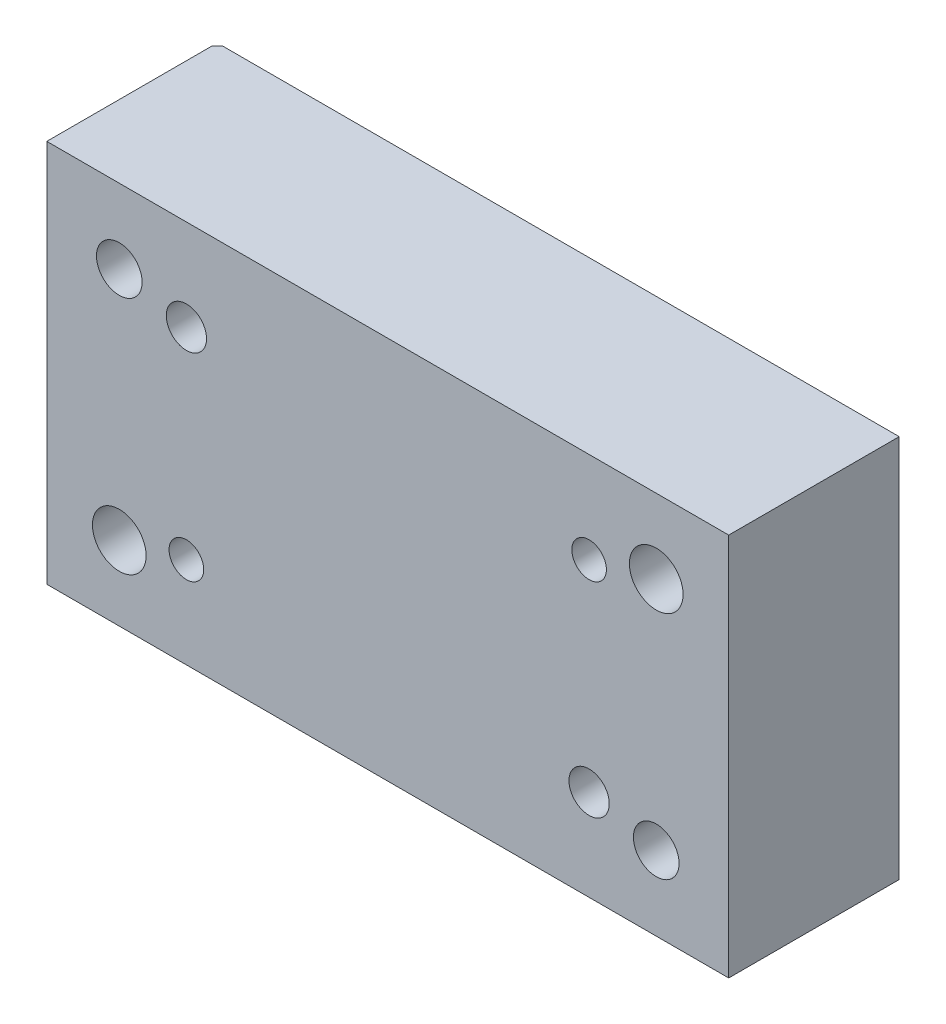
ISO-10303-21;
HEADER;
FILE_DESCRIPTION(('STEP AP214'),'2;1');
FILE_NAME('part.step','',(''),(''),'','','');
FILE_SCHEMA(('AUTOMOTIVE_DESIGN { 1 0 10303 214 1 1 1 1 }'));
ENDSEC;
DATA;
#1=APPLICATION_CONTEXT('core data for automotive mechanical design processes');
#2=APPLICATION_PROTOCOL_DEFINITION('international standard','automotive_design',2000,#1);
#3=PRODUCT_CONTEXT('',#1,'mechanical');
#4=PRODUCT('Part','Part','',(#3));
#5=PRODUCT_RELATED_PRODUCT_CATEGORY('part','',(#4));
#6=PRODUCT_DEFINITION_FORMATION('','',#4);
#7=PRODUCT_DEFINITION_CONTEXT('part definition',#1,'design');
#8=PRODUCT_DEFINITION('design','',#6,#7);
#9=PRODUCT_DEFINITION_SHAPE('','',#8);
#10=(LENGTH_UNIT() NAMED_UNIT(*) SI_UNIT(.MILLI.,.METRE.));
#11=(NAMED_UNIT(*) PLANE_ANGLE_UNIT() SI_UNIT($,.RADIAN.));
#12=(NAMED_UNIT(*) SI_UNIT($,.STERADIAN.) SOLID_ANGLE_UNIT());
#13=UNCERTAINTY_MEASURE_WITH_UNIT(LENGTH_MEASURE(1.E-05),#10,'distance_accuracy_value','');
#14=(GEOMETRIC_REPRESENTATION_CONTEXT(3) GLOBAL_UNCERTAINTY_ASSIGNED_CONTEXT((#13)) GLOBAL_UNIT_ASSIGNED_CONTEXT((#10,
#11,#12)) REPRESENTATION_CONTEXT('',''));
#15=CARTESIAN_POINT('',(0.,0.,0.));
#16=DIRECTION('',(0.,0.,1.));
#17=DIRECTION('',(1.,0.,0.));
#18=AXIS2_PLACEMENT_3D('',#15,#16,#17);
#19=CARTESIAN_POINT('',(-50.8,28.575,25.4));
#20=DIRECTION('',(1.,0.,0.));
#21=DIRECTION('',(0.,0.,-1.));
#22=AXIS2_PLACEMENT_3D('',#19,#20,#21);
#23=PLANE('',#22);
#24=DIRECTION('',(0.,0.707106781186547,0.707106781186548));
#25=VECTOR('',#24,1.);
#26=CARTESIAN_POINT('',(-50.8,40.878125,13.096875));
#27=LINE('',#26,#25);
#28=CARTESIAN_POINT('',(-50.8,27.78125,0.));
#29=VERTEX_POINT('',#28);
#30=CARTESIAN_POINT('',(-50.8,28.575,0.793749999999996));
#31=VERTEX_POINT('',#30);
#32=EDGE_CURVE('E91',#29,#31,#27,.T.);
#33=ORIENTED_EDGE('',*,*,#32,.F.);
#34=DIRECTION('',(0.,-1.,0.));
#35=VECTOR('',#34,1.);
#36=CARTESIAN_POINT('',(-50.8,28.575,0.));
#37=LINE('',#36,#35);
#38=CARTESIAN_POINT('',(-50.8,-28.575,0.));
#39=VERTEX_POINT('',#38);
#40=EDGE_CURVE('E80',#29,#39,#37,.T.);
#41=ORIENTED_EDGE('',*,*,#40,.T.);
#42=DIRECTION('',(0.,0.,-1.));
#43=VECTOR('',#42,1.);
#44=CARTESIAN_POINT('',(-50.8,-28.575,25.4));
#45=LINE('',#44,#43);
#46=CARTESIAN_POINT('',(-50.8,-28.575,25.4));
#47=VERTEX_POINT('',#46);
#48=EDGE_CURVE('E95',#47,#39,#45,.T.);
#49=ORIENTED_EDGE('',*,*,#48,.F.);
#50=DIRECTION('',(0.,-1.,0.));
#51=VECTOR('',#50,1.);
#52=CARTESIAN_POINT('',(-50.8,28.575,25.4));
#53=LINE('',#52,#51);
#54=CARTESIAN_POINT('',(-50.8,28.575,25.4));
#55=VERTEX_POINT('',#54);
#56=EDGE_CURVE('E111',#55,#47,#53,.T.);
#57=ORIENTED_EDGE('',*,*,#56,.F.);
#58=DIRECTION('',(0.,0.,-1.));
#59=VECTOR('',#58,1.);
#60=CARTESIAN_POINT('',(-50.8,28.575,25.4));
#61=LINE('',#60,#59);
#62=EDGE_CURVE('E93',#55,#31,#61,.T.);
#63=ORIENTED_EDGE('',*,*,#62,.T.);
#64=EDGE_LOOP('',(#33,#41,#49,#57,#63));
#65=FACE_BOUND('',#64,.T.);
#66=ADVANCED_FACE('F36',(#65),#23,.F.);
#67=CARTESIAN_POINT('',(-50.8,-28.575,25.4));
#68=DIRECTION('',(0.,1.,0.));
#69=DIRECTION('',(0.,0.,1.));
#70=AXIS2_PLACEMENT_3D('',#67,#68,#69);
#71=PLANE('',#70);
#72=DIRECTION('',(1.,0.,0.));
#73=VECTOR('',#72,1.);
#74=CARTESIAN_POINT('',(-50.8,-28.575,0.));
#75=LINE('',#74,#73);
#76=CARTESIAN_POINT('',(50.8,-28.575,0.));
#77=VERTEX_POINT('',#76);
#78=EDGE_CURVE('E84',#39,#77,#75,.T.);
#79=ORIENTED_EDGE('',*,*,#78,.T.);
#80=DIRECTION('',(0.,0.,-1.));
#81=VECTOR('',#80,1.);
#82=CARTESIAN_POINT('',(50.8,-28.575,25.4));
#83=LINE('',#82,#81);
#84=CARTESIAN_POINT('',(50.8,-28.575,25.4));
#85=VERTEX_POINT('',#84);
#86=EDGE_CURVE('E101',#85,#77,#83,.T.);
#87=ORIENTED_EDGE('',*,*,#86,.F.);
#88=DIRECTION('',(1.,0.,0.));
#89=VECTOR('',#88,1.);
#90=CARTESIAN_POINT('',(-50.8,-28.575,25.4));
#91=LINE('',#90,#89);
#92=EDGE_CURVE('E118',#47,#85,#91,.T.);
#93=ORIENTED_EDGE('',*,*,#92,.F.);
#94=ORIENTED_EDGE('',*,*,#48,.T.);
#95=EDGE_LOOP('',(#79,#87,#93,#94));
#96=FACE_BOUND('',#95,.T.);
#97=ADVANCED_FACE('F214',(#96),#71,.F.);
#98=CARTESIAN_POINT('',(50.8,28.575,25.4));
#99=DIRECTION('',(-1.,0.,0.));
#100=DIRECTION('',(0.,0.,1.));
#101=AXIS2_PLACEMENT_3D('',#98,#99,#100);
#102=PLANE('',#101);
#103=DIRECTION('',(0.,1.,0.));
#104=VECTOR('',#103,1.);
#105=CARTESIAN_POINT('',(50.8,28.575,0.));
#106=LINE('',#105,#104);
#107=CARTESIAN_POINT('',(50.8,28.575,0.));
#108=VERTEX_POINT('',#107);
#109=EDGE_CURVE('E112',#77,#108,#106,.T.);
#110=ORIENTED_EDGE('',*,*,#109,.T.);
#111=DIRECTION('',(0.,0.,-1.));
#112=VECTOR('',#111,1.);
#113=CARTESIAN_POINT('',(50.8,28.575,25.4));
#114=LINE('',#113,#112);
#115=CARTESIAN_POINT('',(50.8,28.575,25.4));
#116=VERTEX_POINT('',#115);
#117=EDGE_CURVE('E104',#116,#108,#114,.T.);
#118=ORIENTED_EDGE('',*,*,#117,.F.);
#119=DIRECTION('',(0.,1.,0.));
#120=VECTOR('',#119,1.);
#121=CARTESIAN_POINT('',(50.8,28.575,25.4));
#122=LINE('',#121,#120);
#123=EDGE_CURVE('E116',#85,#116,#122,.T.);
#124=ORIENTED_EDGE('',*,*,#123,.F.);
#125=ORIENTED_EDGE('',*,*,#86,.T.);
#126=EDGE_LOOP('',(#110,#118,#124,#125));
#127=FACE_BOUND('',#126,.T.);
#128=ADVANCED_FACE('F218',(#127),#102,.F.);
#129=CARTESIAN_POINT('',(-50.8,28.575,25.4));
#130=DIRECTION('',(0.,-1.,0.));
#131=DIRECTION('',(0.,0.,-1.));
#132=AXIS2_PLACEMENT_3D('',#129,#130,#131);
#133=PLANE('',#132);
#134=DIRECTION('',(0.707106781186548,0.,-0.707106781186547));
#135=VECTOR('',#134,1.);
#136=CARTESIAN_POINT('',(-63.103125,28.575,13.096875));
#137=LINE('',#136,#135);
#138=CARTESIAN_POINT('',(-50.00625,28.575,0.));
#139=VERTEX_POINT('',#138);
#140=EDGE_CURVE('E44',#31,#139,#137,.T.);
#141=ORIENTED_EDGE('',*,*,#140,.F.);
#142=ORIENTED_EDGE('',*,*,#62,.F.);
#143=DIRECTION('',(-1.,0.,0.));
#144=VECTOR('',#143,1.);
#145=CARTESIAN_POINT('',(-50.8,28.575,25.4));
#146=LINE('',#145,#144);
#147=EDGE_CURVE('E108',#116,#55,#146,.T.);
#148=ORIENTED_EDGE('',*,*,#147,.F.);
#149=ORIENTED_EDGE('',*,*,#117,.T.);
#150=DIRECTION('',(-1.,0.,0.));
#151=VECTOR('',#150,1.);
#152=CARTESIAN_POINT('',(-50.8,28.575,0.));
#153=LINE('',#152,#151);
#154=EDGE_CURVE('E109',#108,#139,#153,.T.);
#155=ORIENTED_EDGE('',*,*,#154,.T.);
#156=EDGE_LOOP('',(#141,#142,#148,#149,#155));
#157=FACE_BOUND('',#156,.T.);
#158=ADVANCED_FACE('F208',(#157),#133,.F.);
#159=CARTESIAN_POINT('',(0.,0.,25.4));
#160=DIRECTION('',(0.,0.,1.));
#161=DIRECTION('',(1.,0.,0.));
#162=AXIS2_PLACEMENT_3D('',#159,#160,#161);
#163=PLANE('',#162);
#164=CARTESIAN_POINT('',(29.9999999999999,-15.0000000000002,25.4));
#165=DIRECTION('',(0.,0.,-1.));
#166=DIRECTION('',(-1.,0.,0.));
#167=AXIS2_PLACEMENT_3D('',#164,#165,#166);
#168=CIRCLE('',#167,3.);
#169=CARTESIAN_POINT('',(26.9999999999999,-15.0000000000002,25.4));
#170=VERTEX_POINT('',#169);
#171=EDGE_CURVE('E172',#170,#170,#168,.T.);
#172=ORIENTED_EDGE('',*,*,#171,.T.);
#173=EDGE_LOOP('',(#172));
#174=FACE_BOUND('',#173,.T.);
#175=CARTESIAN_POINT('',(-30.,15.0000000000002,25.4));
#176=DIRECTION('',(0.,0.,-1.));
#177=DIRECTION('',(-1.,0.,0.));
#178=AXIS2_PLACEMENT_3D('',#175,#176,#177);
#179=CIRCLE('',#178,3.);
#180=CARTESIAN_POINT('',(-32.9999999999999,15.0000000000002,25.4));
#181=VERTEX_POINT('',#180);
#182=EDGE_CURVE('E166',#181,#181,#179,.T.);
#183=ORIENTED_EDGE('',*,*,#182,.T.);
#184=EDGE_LOOP('',(#183));
#185=FACE_BOUND('',#184,.T.);
#186=CARTESIAN_POINT('',(30.,14.9999999999998,25.4));
#187=DIRECTION('',(0.,0.,-1.));
#188=DIRECTION('',(-1.,0.,0.));
#189=AXIS2_PLACEMENT_3D('',#186,#187,#188);
#190=CIRCLE('',#189,2.57649999999999);
#191=CARTESIAN_POINT('',(27.4235000000001,14.9999999999998,25.4));
#192=VERTEX_POINT('',#191);
#193=EDGE_CURVE('E163',#192,#192,#190,.T.);
#194=ORIENTED_EDGE('',*,*,#193,.T.);
#195=EDGE_LOOP('',(#194));
#196=FACE_BOUND('',#195,.T.);
#197=CARTESIAN_POINT('',(-30.0000000000001,-14.9999999999998,25.4));
#198=DIRECTION('',(0.,0.,-1.));
#199=DIRECTION('',(-1.,0.,0.));
#200=AXIS2_PLACEMENT_3D('',#197,#198,#199);
#201=CIRCLE('',#200,2.5765);
#202=CARTESIAN_POINT('',(-32.5765000000001,-14.9999999999998,25.4));
#203=VERTEX_POINT('',#202);
#204=EDGE_CURVE('E160',#203,#203,#201,.T.);
#205=ORIENTED_EDGE('',*,*,#204,.T.);
#206=EDGE_LOOP('',(#205));
#207=FACE_BOUND('',#206,.T.);
#208=CARTESIAN_POINT('',(40.,-17.5,25.4));
#209=DIRECTION('',(0.,0.,1.));
#210=DIRECTION('',(1.,0.,0.));
#211=AXIS2_PLACEMENT_3D('',#208,#209,#210);
#212=CIRCLE('',#211,3.39999999999999);
#213=CARTESIAN_POINT('',(43.4,-17.5,25.4));
#214=VERTEX_POINT('',#213);
#215=EDGE_CURVE('E142',#214,#214,#212,.T.);
#216=ORIENTED_EDGE('',*,*,#215,.F.);
#217=EDGE_LOOP('',(#216));
#218=FACE_BOUND('',#217,.T.);
#219=CARTESIAN_POINT('',(-40.,17.5,25.4));
#220=DIRECTION('',(0.,0.,1.));
#221=DIRECTION('',(1.,0.,0.));
#222=AXIS2_PLACEMENT_3D('',#219,#220,#221);
#223=CIRCLE('',#222,3.39999999999999);
#224=CARTESIAN_POINT('',(-36.6000000000001,17.5,25.4));
#225=VERTEX_POINT('',#224);
#226=EDGE_CURVE('E136',#225,#225,#223,.T.);
#227=ORIENTED_EDGE('',*,*,#226,.F.);
#228=EDGE_LOOP('',(#227));
#229=FACE_BOUND('',#228,.T.);
#230=CARTESIAN_POINT('',(40.,17.5,25.4));
#231=DIRECTION('',(0.,0.,1.));
#232=DIRECTION('',(1.,0.,0.));
#233=AXIS2_PLACEMENT_3D('',#230,#231,#232);
#234=CIRCLE('',#233,3.99999999999999);
#235=CARTESIAN_POINT('',(44.,17.5,25.4));
#236=VERTEX_POINT('',#235);
#237=EDGE_CURVE('E130',#236,#236,#234,.T.);
#238=ORIENTED_EDGE('',*,*,#237,.F.);
#239=EDGE_LOOP('',(#238));
#240=FACE_BOUND('',#239,.T.);
#241=CARTESIAN_POINT('',(-40.,-17.5,25.4));
#242=DIRECTION('',(0.,0.,1.));
#243=DIRECTION('',(1.,0.,0.));
#244=AXIS2_PLACEMENT_3D('',#241,#242,#243);
#245=CIRCLE('',#244,3.99999999999999);
#246=CARTESIAN_POINT('',(-36.,-17.5,25.4));
#247=VERTEX_POINT('',#246);
#248=EDGE_CURVE('E124',#247,#247,#245,.T.);
#249=ORIENTED_EDGE('',*,*,#248,.F.);
#250=EDGE_LOOP('',(#249));
#251=FACE_BOUND('',#250,.T.);
#252=ORIENTED_EDGE('',*,*,#56,.T.);
#253=ORIENTED_EDGE('',*,*,#92,.T.);
#254=ORIENTED_EDGE('',*,*,#123,.T.);
#255=ORIENTED_EDGE('',*,*,#147,.T.);
#256=EDGE_LOOP('',(#252,#253,#254,#255));
#257=FACE_BOUND('',#256,.T.);
#258=ADVANCED_FACE('F183',(#174,#185,#196,#207,#218,#229,#240,#251,#257),#163,.T.);
#259=CARTESIAN_POINT('',(0.,0.,0.));
#260=DIRECTION('',(0.,0.,1.));
#261=DIRECTION('',(1.,0.,0.));
#262=AXIS2_PLACEMENT_3D('',#259,#260,#261);
#263=PLANE('',#262);
#264=CARTESIAN_POINT('',(29.9999999999999,-15.0000000000002,0.));
#265=DIRECTION('',(0.,0.,-1.));
#266=DIRECTION('',(-1.,0.,0.));
#267=AXIS2_PLACEMENT_3D('',#264,#265,#266);
#268=CIRCLE('',#267,3.);
#269=CARTESIAN_POINT('',(26.9999999999999,-15.0000000000002,0.));
#270=VERTEX_POINT('',#269);
#271=EDGE_CURVE('E175',#270,#270,#268,.T.);
#272=ORIENTED_EDGE('',*,*,#271,.F.);
#273=EDGE_LOOP('',(#272));
#274=FACE_BOUND('',#273,.T.);
#275=CARTESIAN_POINT('',(-30.,15.0000000000002,0.));
#276=DIRECTION('',(0.,0.,-1.));
#277=DIRECTION('',(-1.,0.,0.));
#278=AXIS2_PLACEMENT_3D('',#275,#276,#277);
#279=CIRCLE('',#278,3.);
#280=CARTESIAN_POINT('',(-32.9999999999999,15.0000000000002,0.));
#281=VERTEX_POINT('',#280);
#282=EDGE_CURVE('E169',#281,#281,#279,.T.);
#283=ORIENTED_EDGE('',*,*,#282,.F.);
#284=EDGE_LOOP('',(#283));
#285=FACE_BOUND('',#284,.T.);
#286=CARTESIAN_POINT('',(30.0000000000001,14.9999999999998,0.));
#287=DIRECTION('',(0.,0.,-1.));
#288=DIRECTION('',(-1.,0.,0.));
#289=AXIS2_PLACEMENT_3D('',#286,#287,#288);
#290=CIRCLE('',#289,4.99999999999999);
#291=CARTESIAN_POINT('',(25.0000000000001,14.9999999999998,0.));
#292=VERTEX_POINT('',#291);
#293=EDGE_CURVE('E154',#292,#292,#290,.T.);
#294=ORIENTED_EDGE('',*,*,#293,.F.);
#295=EDGE_LOOP('',(#294));
#296=FACE_BOUND('',#295,.T.);
#297=CARTESIAN_POINT('',(-30.0000000000001,-14.9999999999998,0.));
#298=DIRECTION('',(0.,0.,-1.));
#299=DIRECTION('',(-1.,0.,0.));
#300=AXIS2_PLACEMENT_3D('',#297,#298,#299);
#301=CIRCLE('',#300,4.99999999999999);
#302=CARTESIAN_POINT('',(-35.,-14.9999999999998,0.));
#303=VERTEX_POINT('',#302);
#304=EDGE_CURVE('E148',#303,#303,#301,.T.);
#305=ORIENTED_EDGE('',*,*,#304,.F.);
#306=EDGE_LOOP('',(#305));
#307=FACE_BOUND('',#306,.T.);
#308=CARTESIAN_POINT('',(40.,-17.5,0.));
#309=DIRECTION('',(0.,0.,1.));
#310=DIRECTION('',(1.,0.,0.));
#311=AXIS2_PLACEMENT_3D('',#308,#309,#310);
#312=CIRCLE('',#311,3.39999999999999);
#313=CARTESIAN_POINT('',(43.4,-17.5,0.));
#314=VERTEX_POINT('',#313);
#315=EDGE_CURVE('E139',#314,#314,#312,.T.);
#316=ORIENTED_EDGE('',*,*,#315,.T.);
#317=EDGE_LOOP('',(#316));
#318=FACE_BOUND('',#317,.T.);
#319=CARTESIAN_POINT('',(-40.,17.5,0.));
#320=DIRECTION('',(0.,0.,1.));
#321=DIRECTION('',(1.,0.,0.));
#322=AXIS2_PLACEMENT_3D('',#319,#320,#321);
#323=CIRCLE('',#322,3.39999999999999);
#324=CARTESIAN_POINT('',(-36.6000000000001,17.5,0.));
#325=VERTEX_POINT('',#324);
#326=EDGE_CURVE('E133',#325,#325,#323,.T.);
#327=ORIENTED_EDGE('',*,*,#326,.T.);
#328=EDGE_LOOP('',(#327));
#329=FACE_BOUND('',#328,.T.);
#330=CARTESIAN_POINT('',(40.,17.5,0.));
#331=DIRECTION('',(0.,0.,1.));
#332=DIRECTION('',(1.,0.,0.));
#333=AXIS2_PLACEMENT_3D('',#330,#331,#332);
#334=CIRCLE('',#333,3.99999999999998);
#335=CARTESIAN_POINT('',(44.,17.5,0.));
#336=VERTEX_POINT('',#335);
#337=EDGE_CURVE('E127',#336,#336,#334,.T.);
#338=ORIENTED_EDGE('',*,*,#337,.T.);
#339=EDGE_LOOP('',(#338));
#340=FACE_BOUND('',#339,.T.);
#341=CARTESIAN_POINT('',(-40.,-17.5,0.));
#342=DIRECTION('',(0.,0.,1.));
#343=DIRECTION('',(1.,0.,0.));
#344=AXIS2_PLACEMENT_3D('',#341,#342,#343);
#345=CIRCLE('',#344,3.99999999999998);
#346=CARTESIAN_POINT('',(-36.,-17.5,0.));
#347=VERTEX_POINT('',#346);
#348=EDGE_CURVE('E88',#347,#347,#345,.T.);
#349=ORIENTED_EDGE('',*,*,#348,.T.);
#350=EDGE_LOOP('',(#349));
#351=FACE_BOUND('',#350,.T.);
#352=DIRECTION('',(-0.707106781186549,-0.707106781186546,0.));
#353=VECTOR('',#352,1.);
#354=CARTESIAN_POINT('',(-39.2906249999999,39.2906250000001,0.));
#355=LINE('',#354,#353);
#356=EDGE_CURVE('E11',#139,#29,#355,.T.);
#357=ORIENTED_EDGE('',*,*,#356,.F.);
#358=ORIENTED_EDGE('',*,*,#154,.F.);
#359=ORIENTED_EDGE('',*,*,#109,.F.);
#360=ORIENTED_EDGE('',*,*,#78,.F.);
#361=ORIENTED_EDGE('',*,*,#40,.F.);
#362=EDGE_LOOP('',(#357,#358,#359,#360,#361));
#363=FACE_BOUND('',#362,.T.);
#364=ADVANCED_FACE('F82',(#274,#285,#296,#307,#318,#329,#340,#351,#363),#263,.F.);
#365=CARTESIAN_POINT('',(-26.1937499999999,26.19375,-26.19375));
#366=DIRECTION('',(-0.577350269189624,0.577350269189627,-0.577350269189626));
#367=DIRECTION('',(0.,0.707106781186547,0.707106781186548));
#368=AXIS2_PLACEMENT_3D('',#365,#366,#367);
#369=PLANE('',#368);
#370=ORIENTED_EDGE('',*,*,#356,.T.);
#371=ORIENTED_EDGE('',*,*,#32,.T.);
#372=ORIENTED_EDGE('',*,*,#140,.T.);
#373=EDGE_LOOP('',(#370,#371,#372));
#374=FACE_BOUND('',#373,.T.);
#375=ADVANCED_FACE('F97',(#374),#369,.T.);
#376=CARTESIAN_POINT('',(-40.,-17.5,25.4));
#377=DIRECTION('',(0.,0.,1.));
#378=DIRECTION('',(1.,0.,0.));
#379=AXIS2_PLACEMENT_3D('',#376,#377,#378);
#380=CYLINDRICAL_SURFACE('',#379,3.99999999999999);
#381=ORIENTED_EDGE('',*,*,#348,.F.);
#382=EDGE_LOOP('',(#381));
#383=FACE_BOUND('',#382,.T.);
#384=ORIENTED_EDGE('',*,*,#248,.T.);
#385=EDGE_LOOP('',(#384));
#386=FACE_BOUND('',#385,.T.);
#387=ADVANCED_FACE('F199',(#383,#386),#380,.F.);
#388=CARTESIAN_POINT('',(40.,17.5,25.4));
#389=DIRECTION('',(0.,0.,1.));
#390=DIRECTION('',(1.,0.,0.));
#391=AXIS2_PLACEMENT_3D('',#388,#389,#390);
#392=CYLINDRICAL_SURFACE('',#391,3.99999999999999);
#393=ORIENTED_EDGE('',*,*,#337,.F.);
#394=EDGE_LOOP('',(#393));
#395=FACE_BOUND('',#394,.T.);
#396=ORIENTED_EDGE('',*,*,#237,.T.);
#397=EDGE_LOOP('',(#396));
#398=FACE_BOUND('',#397,.T.);
#399=ADVANCED_FACE('F202',(#395,#398),#392,.F.);
#400=CARTESIAN_POINT('',(-40.,17.5,25.4));
#401=DIRECTION('',(0.,0.,1.));
#402=DIRECTION('',(1.,0.,0.));
#403=AXIS2_PLACEMENT_3D('',#400,#401,#402);
#404=CYLINDRICAL_SURFACE('',#403,3.39999999999999);
#405=ORIENTED_EDGE('',*,*,#326,.F.);
#406=EDGE_LOOP('',(#405));
#407=FACE_BOUND('',#406,.T.);
#408=ORIENTED_EDGE('',*,*,#226,.T.);
#409=EDGE_LOOP('',(#408));
#410=FACE_BOUND('',#409,.T.);
#411=ADVANCED_FACE('F268',(#407,#410),#404,.F.);
#412=CARTESIAN_POINT('',(40.,-17.5,25.4));
#413=DIRECTION('',(0.,0.,1.));
#414=DIRECTION('',(1.,0.,0.));
#415=AXIS2_PLACEMENT_3D('',#412,#413,#414);
#416=CYLINDRICAL_SURFACE('',#415,3.39999999999999);
#417=ORIENTED_EDGE('',*,*,#315,.F.);
#418=EDGE_LOOP('',(#417));
#419=FACE_BOUND('',#418,.T.);
#420=ORIENTED_EDGE('',*,*,#215,.T.);
#421=EDGE_LOOP('',(#420));
#422=FACE_BOUND('',#421,.T.);
#423=ADVANCED_FACE('F279',(#419,#422),#416,.F.);
#424=CARTESIAN_POINT('',(-30.0000000000001,-14.9999999999998,5.999988));
#425=DIRECTION('',(0.,0.,-1.));
#426=DIRECTION('',(-1.,0.,0.));
#427=AXIS2_PLACEMENT_3D('',#424,#425,#426);
#428=CONICAL_SURFACE('',#427,5.,1.02974425867665);
#429=CARTESIAN_POINT('',(-30.0000000000001,-14.9999999999998,7.4561737102133));
#430=DIRECTION('',(0.,0.,-1.));
#431=DIRECTION('',(-1.,0.,0.));
#432=AXIS2_PLACEMENT_3D('',#429,#430,#431);
#433=CIRCLE('',#432,2.57649999999999);
#434=CARTESIAN_POINT('',(-32.5765000000001,-14.9999999999998,7.4561737102133));
#435=VERTEX_POINT('',#434);
#436=EDGE_CURVE('E157',#435,#435,#433,.F.);
#437=ORIENTED_EDGE('',*,*,#436,.T.);
#438=EDGE_LOOP('',(#437));
#439=FACE_BOUND('',#438,.T.);
#440=CARTESIAN_POINT('',(-30.0000000000001,-14.9999999999998,5.999988));
#441=DIRECTION('',(0.,0.,-1.));
#442=DIRECTION('',(-1.,0.,0.));
#443=AXIS2_PLACEMENT_3D('',#440,#441,#442);
#444=CIRCLE('',#443,5.);
#445=CARTESIAN_POINT('',(-35.,-14.9999999999998,5.999988));
#446=VERTEX_POINT('',#445);
#447=EDGE_CURVE('E145',#446,#446,#444,.T.);
#448=ORIENTED_EDGE('',*,*,#447,.T.);
#449=EDGE_LOOP('',(#448));
#450=FACE_BOUND('',#449,.T.);
#451=ADVANCED_FACE('F291',(#439,#450),#428,.F.);
#452=CARTESIAN_POINT('',(-30.0000000000001,-14.9999999999998,0.));
#453=DIRECTION('',(0.,0.,-1.));
#454=DIRECTION('',(-1.,0.,0.));
#455=AXIS2_PLACEMENT_3D('',#452,#453,#454);
#456=CYLINDRICAL_SURFACE('',#455,4.99999999999999);
#457=ORIENTED_EDGE('',*,*,#447,.F.);
#458=EDGE_LOOP('',(#457));
#459=FACE_BOUND('',#458,.T.);
#460=ORIENTED_EDGE('',*,*,#304,.T.);
#461=EDGE_LOOP('',(#460));
#462=FACE_BOUND('',#461,.T.);
#463=ADVANCED_FACE('F299',(#459,#462),#456,.F.);
#464=CARTESIAN_POINT('',(30.0000000000001,14.9999999999998,5.999988));
#465=DIRECTION('',(0.,0.,-1.));
#466=DIRECTION('',(-1.,0.,0.));
#467=AXIS2_PLACEMENT_3D('',#464,#465,#466);
#468=CONICAL_SURFACE('',#467,5.,1.02974425867665);
#469=CARTESIAN_POINT('',(30.0000000000001,14.9999999999998,7.4561737102133));
#470=DIRECTION('',(0.,0.,-1.));
#471=DIRECTION('',(-1.,0.,0.));
#472=AXIS2_PLACEMENT_3D('',#469,#470,#471);
#473=CIRCLE('',#472,2.57649999999999);
#474=CARTESIAN_POINT('',(27.4235000000001,14.9999999999998,7.4561737102133));
#475=VERTEX_POINT('',#474);
#476=EDGE_CURVE('E39',#475,#475,#473,.F.);
#477=ORIENTED_EDGE('',*,*,#476,.T.);
#478=EDGE_LOOP('',(#477));
#479=FACE_BOUND('',#478,.T.);
#480=CARTESIAN_POINT('',(30.0000000000001,14.9999999999998,5.999988));
#481=DIRECTION('',(0.,0.,-1.));
#482=DIRECTION('',(-1.,0.,0.));
#483=AXIS2_PLACEMENT_3D('',#480,#481,#482);
#484=CIRCLE('',#483,5.);
#485=CARTESIAN_POINT('',(25.0000000000001,14.9999999999998,5.999988));
#486=VERTEX_POINT('',#485);
#487=EDGE_CURVE('E151',#486,#486,#484,.T.);
#488=ORIENTED_EDGE('',*,*,#487,.T.);
#489=EDGE_LOOP('',(#488));
#490=FACE_BOUND('',#489,.T.);
#491=ADVANCED_FACE('F304',(#479,#490),#468,.F.);
#492=CARTESIAN_POINT('',(30.0000000000001,14.9999999999998,0.));
#493=DIRECTION('',(0.,0.,-1.));
#494=DIRECTION('',(-1.,0.,0.));
#495=AXIS2_PLACEMENT_3D('',#492,#493,#494);
#496=CYLINDRICAL_SURFACE('',#495,4.99999999999999);
#497=ORIENTED_EDGE('',*,*,#487,.F.);
#498=EDGE_LOOP('',(#497));
#499=FACE_BOUND('',#498,.T.);
#500=ORIENTED_EDGE('',*,*,#293,.T.);
#501=EDGE_LOOP('',(#500));
#502=FACE_BOUND('',#501,.T.);
#503=ADVANCED_FACE('F313',(#499,#502),#496,.F.);
#504=CARTESIAN_POINT('',(-30.0000000000001,-14.9999999999998,0.));
#505=DIRECTION('',(0.,0.,-1.));
#506=DIRECTION('',(-1.,0.,0.));
#507=AXIS2_PLACEMENT_3D('',#504,#505,#506);
#508=CYLINDRICAL_SURFACE('',#507,2.57649999999999);
#509=ORIENTED_EDGE('',*,*,#204,.F.);
#510=EDGE_LOOP('',(#509));
#511=FACE_BOUND('',#510,.T.);
#512=ORIENTED_EDGE('',*,*,#436,.F.);
#513=EDGE_LOOP('',(#512));
#514=FACE_BOUND('',#513,.T.);
#515=ADVANCED_FACE('F318',(#511,#514),#508,.F.);
#516=CARTESIAN_POINT('',(30.,14.9999999999998,0.));
#517=DIRECTION('',(0.,0.,-1.));
#518=DIRECTION('',(-1.,0.,0.));
#519=AXIS2_PLACEMENT_3D('',#516,#517,#518);
#520=CYLINDRICAL_SURFACE('',#519,2.57649999999999);
#521=ORIENTED_EDGE('',*,*,#193,.F.);
#522=EDGE_LOOP('',(#521));
#523=FACE_BOUND('',#522,.T.);
#524=ORIENTED_EDGE('',*,*,#476,.F.);
#525=EDGE_LOOP('',(#524));
#526=FACE_BOUND('',#525,.T.);
#527=ADVANCED_FACE('F342',(#523,#526),#520,.F.);
#528=CARTESIAN_POINT('',(-30.,15.0000000000002,0.));
#529=DIRECTION('',(0.,0.,-1.));
#530=DIRECTION('',(-1.,0.,0.));
#531=AXIS2_PLACEMENT_3D('',#528,#529,#530);
#532=CYLINDRICAL_SURFACE('',#531,3.);
#533=ORIENTED_EDGE('',*,*,#182,.F.);
#534=EDGE_LOOP('',(#533));
#535=FACE_BOUND('',#534,.T.);
#536=ORIENTED_EDGE('',*,*,#282,.T.);
#537=EDGE_LOOP('',(#536));
#538=FACE_BOUND('',#537,.T.);
#539=ADVANCED_FACE('F353',(#535,#538),#532,.F.);
#540=CARTESIAN_POINT('',(29.9999999999999,-15.0000000000002,0.));
#541=DIRECTION('',(0.,0.,-1.));
#542=DIRECTION('',(-1.,0.,0.));
#543=AXIS2_PLACEMENT_3D('',#540,#541,#542);
#544=CYLINDRICAL_SURFACE('',#543,3.);
#545=ORIENTED_EDGE('',*,*,#171,.F.);
#546=EDGE_LOOP('',(#545));
#547=FACE_BOUND('',#546,.T.);
#548=ORIENTED_EDGE('',*,*,#271,.T.);
#549=EDGE_LOOP('',(#548));
#550=FACE_BOUND('',#549,.T.);
#551=ADVANCED_FACE('F179',(#547,#550),#544,.F.);
#552=CLOSED_SHELL('',(#66,#97,#128,#158,#258,#364,#375,#387,#399,#411,#423,#451,#463,#491,#503,
#515,#527,#539,#551));
#553=MANIFOLD_SOLID_BREP('B2',#552);
#554=ADVANCED_BREP_SHAPE_REPRESENTATION('',(#18,#553),#14);
#555=SHAPE_DEFINITION_REPRESENTATION(#9,#554);
ENDSEC;
END-ISO-10303-21;
